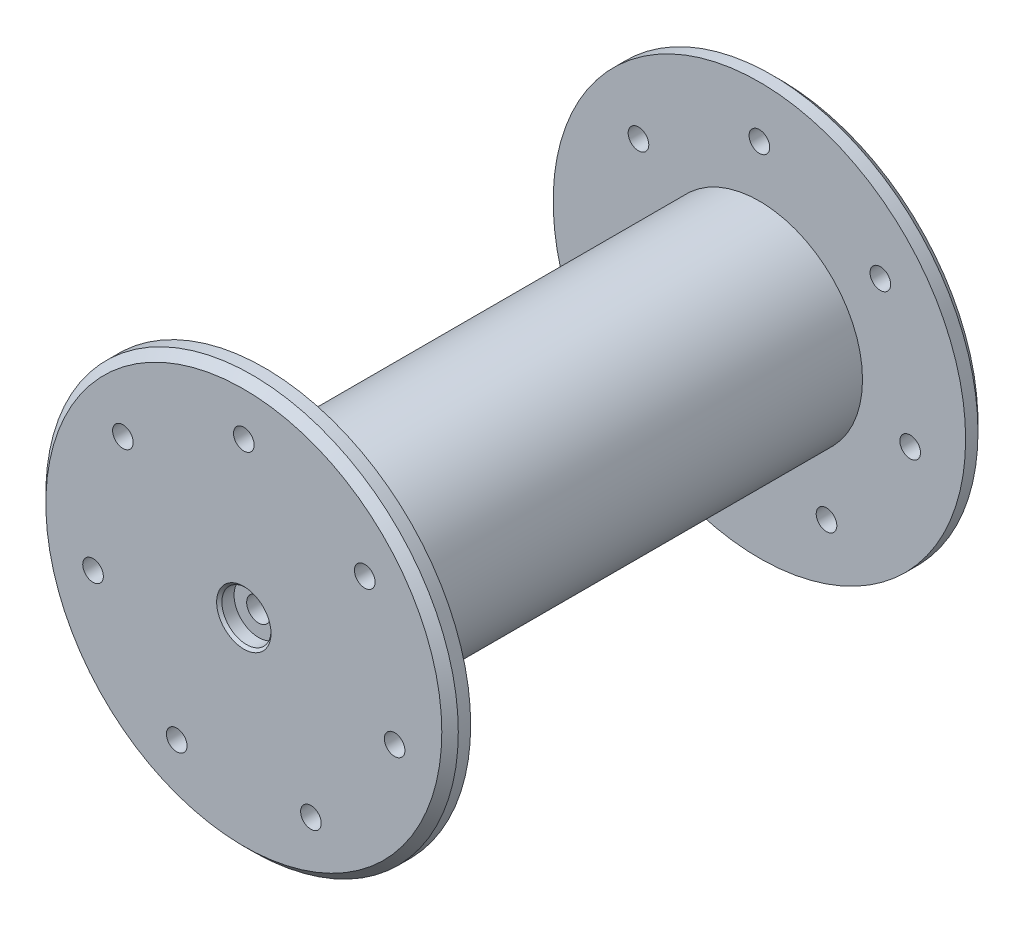
ISO-10303-21;
HEADER;
FILE_DESCRIPTION(('STEP AP214'),'2;1');
FILE_NAME('part.step','',(''),(''),'','','');
FILE_SCHEMA(('AUTOMOTIVE_DESIGN { 1 0 10303 214 1 1 1 1 }'));
ENDSEC;
DATA;
#1=APPLICATION_CONTEXT('core data for automotive mechanical design processes');
#2=APPLICATION_PROTOCOL_DEFINITION('international standard','automotive_design',2000,#1);
#3=PRODUCT_CONTEXT('',#1,'mechanical');
#4=PRODUCT('Part','Part','',(#3));
#5=PRODUCT_RELATED_PRODUCT_CATEGORY('part','',(#4));
#6=PRODUCT_DEFINITION_FORMATION('','',#4);
#7=PRODUCT_DEFINITION_CONTEXT('part definition',#1,'design');
#8=PRODUCT_DEFINITION('design','',#6,#7);
#9=PRODUCT_DEFINITION_SHAPE('','',#8);
#10=(LENGTH_UNIT() NAMED_UNIT(*) SI_UNIT(.MILLI.,.METRE.));
#11=(NAMED_UNIT(*) PLANE_ANGLE_UNIT() SI_UNIT($,.RADIAN.));
#12=(NAMED_UNIT(*) SI_UNIT($,.STERADIAN.) SOLID_ANGLE_UNIT());
#13=UNCERTAINTY_MEASURE_WITH_UNIT(LENGTH_MEASURE(1.E-05),#10,'distance_accuracy_value','');
#14=(GEOMETRIC_REPRESENTATION_CONTEXT(3) GLOBAL_UNCERTAINTY_ASSIGNED_CONTEXT((#13)) GLOBAL_UNIT_ASSIGNED_CONTEXT((#10,
#11,#12)) REPRESENTATION_CONTEXT('',''));
#15=CARTESIAN_POINT('',(0.,0.,0.));
#16=DIRECTION('',(0.,0.,1.));
#17=DIRECTION('',(1.,0.,0.));
#18=AXIS2_PLACEMENT_3D('',#15,#16,#17);
#19=CARTESIAN_POINT('',(0.,0.,60.));
#20=DIRECTION('',(0.,0.,-1.));
#21=DIRECTION('',(-1.,0.,0.));
#22=AXIS2_PLACEMENT_3D('',#19,#20,#21);
#23=CYLINDRICAL_SURFACE('',#22,25.);
#24=CARTESIAN_POINT('',(0.,0.,60.));
#25=DIRECTION('',(0.,0.,1.));
#26=DIRECTION('',(1.,0.,0.));
#27=AXIS2_PLACEMENT_3D('',#24,#25,#26);
#28=CIRCLE('',#27,25.);
#29=CARTESIAN_POINT('',(25.,0.,60.));
#30=VERTEX_POINT('',#29);
#31=EDGE_CURVE('E92',#30,#30,#28,.T.);
#32=ORIENTED_EDGE('',*,*,#31,.F.);
#33=EDGE_LOOP('',(#32));
#34=FACE_BOUND('',#33,.T.);
#35=CARTESIAN_POINT('',(0.,0.,-60.));
#36=DIRECTION('',(0.,0.,1.));
#37=DIRECTION('',(1.,0.,0.));
#38=AXIS2_PLACEMENT_3D('',#35,#36,#37);
#39=CIRCLE('',#38,25.);
#40=CARTESIAN_POINT('',(25.,0.,-60.));
#41=VERTEX_POINT('',#40);
#42=EDGE_CURVE('E93',#41,#41,#39,.T.);
#43=ORIENTED_EDGE('',*,*,#42,.T.);
#44=EDGE_LOOP('',(#43));
#45=FACE_BOUND('',#44,.T.);
#46=ADVANCED_FACE('F37',(#34,#45),#23,.T.);
#47=CARTESIAN_POINT('',(0.,0.,65.));
#48=DIRECTION('',(0.,0.,-1.));
#49=DIRECTION('',(-1.,0.,0.));
#50=AXIS2_PLACEMENT_3D('',#47,#48,#49);
#51=CYLINDRICAL_SURFACE('',#50,50.);
#52=CARTESIAN_POINT('',(0.,0.,63.));
#53=DIRECTION('',(0.,0.,1.));
#54=DIRECTION('',(1.,0.,0.));
#55=AXIS2_PLACEMENT_3D('',#52,#53,#54);
#56=CIRCLE('',#55,50.);
#57=CARTESIAN_POINT('',(50.,0.,63.));
#58=VERTEX_POINT('',#57);
#59=EDGE_CURVE('E50',#58,#58,#56,.F.);
#60=ORIENTED_EDGE('',*,*,#59,.T.);
#61=EDGE_LOOP('',(#60));
#62=FACE_BOUND('',#61,.T.);
#63=CARTESIAN_POINT('',(0.,0.,60.));
#64=DIRECTION('',(0.,0.,1.));
#65=DIRECTION('',(1.,0.,0.));
#66=AXIS2_PLACEMENT_3D('',#63,#64,#65);
#67=CIRCLE('',#66,50.);
#68=CARTESIAN_POINT('',(50.,0.,60.));
#69=VERTEX_POINT('',#68);
#70=EDGE_CURVE('E87',#69,#69,#67,.T.);
#71=ORIENTED_EDGE('',*,*,#70,.T.);
#72=EDGE_LOOP('',(#71));
#73=FACE_BOUND('',#72,.T.);
#74=ADVANCED_FACE('F268',(#62,#73),#51,.T.);
#75=CARTESIAN_POINT('',(0.,0.,65.));
#76=DIRECTION('',(0.,0.,1.));
#77=DIRECTION('',(1.,0.,0.));
#78=AXIS2_PLACEMENT_3D('',#75,#76,#77);
#79=PLANE('',#78);
#80=CARTESIAN_POINT('',(0.,0.,65.));
#81=DIRECTION('',(0.,0.,1.));
#82=DIRECTION('',(1.,0.,0.));
#83=AXIS2_PLACEMENT_3D('',#80,#81,#82);
#84=CIRCLE('',#83,6.58876);
#85=CARTESIAN_POINT('',(6.58876,0.,65.));
#86=VERTEX_POINT('',#85);
#87=EDGE_CURVE('E97',#86,#86,#84,.T.);
#88=ORIENTED_EDGE('',*,*,#87,.F.);
#89=EDGE_LOOP('',(#88));
#90=FACE_BOUND('',#89,.T.);
#91=CARTESIAN_POINT('',(-29.3186805925508,23.3808675697029,65.));
#92=DIRECTION('',(0.,0.,1.));
#93=DIRECTION('',(0.623489801858743,0.781831482468022,0.));
#94=AXIS2_PLACEMENT_3D('',#91,#92,#93);
#95=CIRCLE('',#94,2.5);
#96=CARTESIAN_POINT('',(-27.759956087904,25.3354462758729,65.));
#97=VERTEX_POINT('',#96);
#98=EDGE_CURVE('E112',#97,#97,#95,.T.);
#99=ORIENTED_EDGE('',*,*,#98,.F.);
#100=EDGE_LOOP('',(#99));
#101=FACE_BOUND('',#100,.T.);
#102=CARTESIAN_POINT('',(-36.5597967068185,-8.34453502336144,65.));
#103=DIRECTION('',(0.,0.,1.));
#104=DIRECTION('',(-0.222520933956305,0.974927912181826,0.));
#105=AXIS2_PLACEMENT_3D('',#102,#103,#104);
#106=CIRCLE('',#105,2.5);
#107=CARTESIAN_POINT('',(-37.1160990417092,-5.90721524290687,65.));
#108=VERTEX_POINT('',#107);
#109=EDGE_CURVE('E116',#108,#108,#106,.T.);
#110=ORIENTED_EDGE('',*,*,#109,.F.);
#111=EDGE_LOOP('',(#110));
#112=FACE_BOUND('',#111,.T.);
#113=CARTESIAN_POINT('',(-16.2706402169087,-33.7863325463406,65.));
#114=DIRECTION('',(0.,0.,1.));
#115=DIRECTION('',(-0.900968867902416,0.433883739117565,0.));
#116=AXIS2_PLACEMENT_3D('',#113,#114,#115);
#117=CIRCLE('',#116,2.5);
#118=CARTESIAN_POINT('',(-18.5230623866647,-32.7016231985467,65.));
#119=VERTEX_POINT('',#118);
#120=EDGE_CURVE('E121',#119,#119,#117,.T.);
#121=ORIENTED_EDGE('',*,*,#120,.F.);
#122=EDGE_LOOP('',(#121));
#123=FACE_BOUND('',#122,.T.);
#124=CARTESIAN_POINT('',(16.2706402169082,-33.7863325463408,65.));
#125=DIRECTION('',(0.,0.,1.));
#126=DIRECTION('',(-0.900968867902422,-0.433883739117553,0.));
#127=AXIS2_PLACEMENT_3D('',#124,#125,#126);
#128=CIRCLE('',#127,2.5);
#129=CARTESIAN_POINT('',(14.0182180471522,-34.8710418941347,65.));
#130=VERTEX_POINT('',#129);
#131=EDGE_CURVE('E125',#130,#130,#128,.T.);
#132=ORIENTED_EDGE('',*,*,#131,.F.);
#133=EDGE_LOOP('',(#132));
#134=FACE_BOUND('',#133,.T.);
#135=CARTESIAN_POINT('',(36.5597967068184,-8.34453502336193,65.));
#136=DIRECTION('',(0.,0.,1.));
#137=DIRECTION('',(-0.222520933956318,-0.974927912181823,0.));
#138=AXIS2_PLACEMENT_3D('',#135,#136,#137);
#139=CIRCLE('',#138,2.5);
#140=CARTESIAN_POINT('',(36.0034943719276,-10.7818548038165,65.));
#141=VERTEX_POINT('',#140);
#142=EDGE_CURVE('E111',#141,#141,#139,.T.);
#143=ORIENTED_EDGE('',*,*,#142,.F.);
#144=EDGE_LOOP('',(#143));
#145=FACE_BOUND('',#144,.T.);
#146=CARTESIAN_POINT('',(29.3186805925512,23.3808675697025,65.));
#147=DIRECTION('',(0.,0.,1.));
#148=DIRECTION('',(0.623489801858732,-0.781831482468031,0.));
#149=AXIS2_PLACEMENT_3D('',#146,#147,#148);
#150=CIRCLE('',#149,2.5);
#151=CARTESIAN_POINT('',(30.877405097198,21.4262888635324,65.));
#152=VERTEX_POINT('',#151);
#153=EDGE_CURVE('E83',#152,#152,#150,.T.);
#154=ORIENTED_EDGE('',*,*,#153,.F.);
#155=EDGE_LOOP('',(#154));
#156=FACE_BOUND('',#155,.T.);
#157=CARTESIAN_POINT('',(0.,37.5,65.));
#158=DIRECTION('',(0.,0.,1.));
#159=DIRECTION('',(1.,0.,0.));
#160=AXIS2_PLACEMENT_3D('',#157,#158,#159);
#161=CIRCLE('',#160,2.5);
#162=CARTESIAN_POINT('',(2.5,37.5,65.));
#163=VERTEX_POINT('',#162);
#164=EDGE_CURVE('E62',#163,#163,#161,.T.);
#165=ORIENTED_EDGE('',*,*,#164,.F.);
#166=EDGE_LOOP('',(#165));
#167=FACE_BOUND('',#166,.T.);
#168=CARTESIAN_POINT('',(0.,0.,65.));
#169=DIRECTION('',(0.,0.,1.));
#170=DIRECTION('',(1.,0.,0.));
#171=AXIS2_PLACEMENT_3D('',#168,#169,#170);
#172=CIRCLE('',#171,48.);
#173=CARTESIAN_POINT('',(48.,0.,65.));
#174=VERTEX_POINT('',#173);
#175=EDGE_CURVE('E55',#174,#174,#172,.T.);
#176=ORIENTED_EDGE('',*,*,#175,.T.);
#177=EDGE_LOOP('',(#176));
#178=FACE_BOUND('',#177,.T.);
#179=ADVANCED_FACE('F274',(#90,#101,#112,#123,#134,#145,#156,#167,#178),#79,.T.);
#180=CARTESIAN_POINT('',(0.,0.,60.));
#181=DIRECTION('',(0.,0.,1.));
#182=DIRECTION('',(1.,0.,0.));
#183=AXIS2_PLACEMENT_3D('',#180,#181,#182);
#184=PLANE('',#183);
#185=CARTESIAN_POINT('',(-29.3186805925508,23.3808675697029,60.));
#186=DIRECTION('',(0.,0.,1.));
#187=DIRECTION('',(1.,0.,0.));
#188=AXIS2_PLACEMENT_3D('',#185,#186,#187);
#189=CIRCLE('',#188,2.5);
#190=CARTESIAN_POINT('',(-26.8186805925508,23.3808675697029,60.));
#191=VERTEX_POINT('',#190);
#192=EDGE_CURVE('E58',#191,#191,#189,.T.);
#193=ORIENTED_EDGE('',*,*,#192,.T.);
#194=EDGE_LOOP('',(#193));
#195=FACE_BOUND('',#194,.T.);
#196=CARTESIAN_POINT('',(-36.5597967068185,-8.34453502336144,60.));
#197=DIRECTION('',(0.,0.,1.));
#198=DIRECTION('',(1.,0.,0.));
#199=AXIS2_PLACEMENT_3D('',#196,#197,#198);
#200=CIRCLE('',#199,2.5);
#201=CARTESIAN_POINT('',(-34.0597967068185,-8.34453502336144,60.));
#202=VERTEX_POINT('',#201);
#203=EDGE_CURVE('E63',#202,#202,#200,.T.);
#204=ORIENTED_EDGE('',*,*,#203,.T.);
#205=EDGE_LOOP('',(#204));
#206=FACE_BOUND('',#205,.T.);
#207=CARTESIAN_POINT('',(-16.2706402169087,-33.7863325463406,60.));
#208=DIRECTION('',(0.,0.,1.));
#209=DIRECTION('',(1.,0.,0.));
#210=AXIS2_PLACEMENT_3D('',#207,#208,#209);
#211=CIRCLE('',#210,2.5);
#212=CARTESIAN_POINT('',(-13.7706402169087,-33.7863325463406,60.));
#213=VERTEX_POINT('',#212);
#214=EDGE_CURVE('E67',#213,#213,#211,.T.);
#215=ORIENTED_EDGE('',*,*,#214,.T.);
#216=EDGE_LOOP('',(#215));
#217=FACE_BOUND('',#216,.T.);
#218=CARTESIAN_POINT('',(16.2706402169082,-33.7863325463408,60.));
#219=DIRECTION('',(0.,0.,1.));
#220=DIRECTION('',(1.,0.,0.));
#221=AXIS2_PLACEMENT_3D('',#218,#219,#220);
#222=CIRCLE('',#221,2.5);
#223=CARTESIAN_POINT('',(18.7706402169082,-33.7863325463408,60.));
#224=VERTEX_POINT('',#223);
#225=EDGE_CURVE('E71',#224,#224,#222,.T.);
#226=ORIENTED_EDGE('',*,*,#225,.T.);
#227=EDGE_LOOP('',(#226));
#228=FACE_BOUND('',#227,.T.);
#229=CARTESIAN_POINT('',(36.5597967068184,-8.34453502336193,60.));
#230=DIRECTION('',(0.,0.,1.));
#231=DIRECTION('',(1.,0.,0.));
#232=AXIS2_PLACEMENT_3D('',#229,#230,#231);
#233=CIRCLE('',#232,2.5);
#234=CARTESIAN_POINT('',(39.0597967068184,-8.34453502336193,60.));
#235=VERTEX_POINT('',#234);
#236=EDGE_CURVE('E75',#235,#235,#233,.T.);
#237=ORIENTED_EDGE('',*,*,#236,.T.);
#238=EDGE_LOOP('',(#237));
#239=FACE_BOUND('',#238,.T.);
#240=CARTESIAN_POINT('',(29.3186805925512,23.3808675697025,60.));
#241=DIRECTION('',(0.,0.,1.));
#242=DIRECTION('',(1.,0.,0.));
#243=AXIS2_PLACEMENT_3D('',#240,#241,#242);
#244=CIRCLE('',#243,2.5);
#245=CARTESIAN_POINT('',(31.8186805925512,23.3808675697025,60.));
#246=VERTEX_POINT('',#245);
#247=EDGE_CURVE('E79',#246,#246,#244,.T.);
#248=ORIENTED_EDGE('',*,*,#247,.T.);
#249=EDGE_LOOP('',(#248));
#250=FACE_BOUND('',#249,.T.);
#251=CARTESIAN_POINT('',(0.,37.5,60.));
#252=DIRECTION('',(0.,0.,1.));
#253=DIRECTION('',(1.,0.,0.));
#254=AXIS2_PLACEMENT_3D('',#251,#252,#253);
#255=CIRCLE('',#254,2.5);
#256=CARTESIAN_POINT('',(2.5,37.5,60.));
#257=VERTEX_POINT('',#256);
#258=EDGE_CURVE('E84',#257,#257,#255,.T.);
#259=ORIENTED_EDGE('',*,*,#258,.T.);
#260=EDGE_LOOP('',(#259));
#261=FACE_BOUND('',#260,.T.);
#262=ORIENTED_EDGE('',*,*,#31,.T.);
#263=EDGE_LOOP('',(#262));
#264=FACE_BOUND('',#263,.T.);
#265=ORIENTED_EDGE('',*,*,#70,.F.);
#266=EDGE_LOOP('',(#265));
#267=FACE_BOUND('',#266,.T.);
#268=ADVANCED_FACE('F283',(#195,#206,#217,#228,#239,#250,#261,#264,#267),#184,.F.);
#269=CARTESIAN_POINT('',(0.,0.,65.));
#270=DIRECTION('',(0.,0.,-1.));
#271=DIRECTION('',(-1.,0.,0.));
#272=AXIS2_PLACEMENT_3D('',#269,#270,#271);
#273=CONICAL_SURFACE('',#272,48.,0.785398163397445);
#274=ORIENTED_EDGE('',*,*,#59,.F.);
#275=EDGE_LOOP('',(#274));
#276=FACE_BOUND('',#275,.T.);
#277=ORIENTED_EDGE('',*,*,#175,.F.);
#278=EDGE_LOOP('',(#277));
#279=FACE_BOUND('',#278,.T.);
#280=ADVANCED_FACE('F280',(#276,#279),#273,.T.);
#281=CARTESIAN_POINT('',(0.,37.5,-60.));
#282=DIRECTION('',(0.,0.,1.));
#283=DIRECTION('',(1.,0.,0.));
#284=AXIS2_PLACEMENT_3D('',#281,#282,#283);
#285=CYLINDRICAL_SURFACE('',#284,2.5);
#286=ORIENTED_EDGE('',*,*,#164,.T.);
#287=EDGE_LOOP('',(#286));
#288=FACE_BOUND('',#287,.T.);
#289=ORIENTED_EDGE('',*,*,#258,.F.);
#290=EDGE_LOOP('',(#289));
#291=FACE_BOUND('',#290,.T.);
#292=ADVANCED_FACE('F282',(#288,#291),#285,.F.);
#293=CARTESIAN_POINT('',(29.3186805925512,23.3808675697025,-60.));
#294=DIRECTION('',(0.,0.,1.));
#295=DIRECTION('',(1.,0.,0.));
#296=AXIS2_PLACEMENT_3D('',#293,#294,#295);
#297=CYLINDRICAL_SURFACE('',#296,2.5);
#298=ORIENTED_EDGE('',*,*,#153,.T.);
#299=EDGE_LOOP('',(#298));
#300=FACE_BOUND('',#299,.T.);
#301=ORIENTED_EDGE('',*,*,#247,.F.);
#302=EDGE_LOOP('',(#301));
#303=FACE_BOUND('',#302,.T.);
#304=ADVANCED_FACE('F289',(#300,#303),#297,.F.);
#305=CARTESIAN_POINT('',(36.5597967068184,-8.34453502336193,-60.));
#306=DIRECTION('',(0.,0.,1.));
#307=DIRECTION('',(1.,0.,0.));
#308=AXIS2_PLACEMENT_3D('',#305,#306,#307);
#309=CYLINDRICAL_SURFACE('',#308,2.5);
#310=ORIENTED_EDGE('',*,*,#142,.T.);
#311=EDGE_LOOP('',(#310));
#312=FACE_BOUND('',#311,.T.);
#313=ORIENTED_EDGE('',*,*,#236,.F.);
#314=EDGE_LOOP('',(#313));
#315=FACE_BOUND('',#314,.T.);
#316=ADVANCED_FACE('F307',(#312,#315),#309,.F.);
#317=CARTESIAN_POINT('',(16.2706402169082,-33.7863325463408,-60.));
#318=DIRECTION('',(0.,0.,1.));
#319=DIRECTION('',(1.,0.,0.));
#320=AXIS2_PLACEMENT_3D('',#317,#318,#319);
#321=CYLINDRICAL_SURFACE('',#320,2.5);
#322=ORIENTED_EDGE('',*,*,#131,.T.);
#323=EDGE_LOOP('',(#322));
#324=FACE_BOUND('',#323,.T.);
#325=ORIENTED_EDGE('',*,*,#225,.F.);
#326=EDGE_LOOP('',(#325));
#327=FACE_BOUND('',#326,.T.);
#328=ADVANCED_FACE('F321',(#324,#327),#321,.F.);
#329=CARTESIAN_POINT('',(-16.2706402169087,-33.7863325463406,-60.));
#330=DIRECTION('',(0.,0.,1.));
#331=DIRECTION('',(1.,0.,0.));
#332=AXIS2_PLACEMENT_3D('',#329,#330,#331);
#333=CYLINDRICAL_SURFACE('',#332,2.5);
#334=ORIENTED_EDGE('',*,*,#120,.T.);
#335=EDGE_LOOP('',(#334));
#336=FACE_BOUND('',#335,.T.);
#337=ORIENTED_EDGE('',*,*,#214,.F.);
#338=EDGE_LOOP('',(#337));
#339=FACE_BOUND('',#338,.T.);
#340=ADVANCED_FACE('F317',(#336,#339),#333,.F.);
#341=CARTESIAN_POINT('',(-36.5597967068185,-8.34453502336144,-60.));
#342=DIRECTION('',(0.,0.,1.));
#343=DIRECTION('',(1.,0.,0.));
#344=AXIS2_PLACEMENT_3D('',#341,#342,#343);
#345=CYLINDRICAL_SURFACE('',#344,2.5);
#346=ORIENTED_EDGE('',*,*,#109,.T.);
#347=EDGE_LOOP('',(#346));
#348=FACE_BOUND('',#347,.T.);
#349=ORIENTED_EDGE('',*,*,#203,.F.);
#350=EDGE_LOOP('',(#349));
#351=FACE_BOUND('',#350,.T.);
#352=ADVANCED_FACE('F313',(#348,#351),#345,.F.);
#353=CARTESIAN_POINT('',(-29.3186805925508,23.3808675697029,-60.));
#354=DIRECTION('',(0.,0.,1.));
#355=DIRECTION('',(1.,0.,0.));
#356=AXIS2_PLACEMENT_3D('',#353,#354,#355);
#357=CYLINDRICAL_SURFACE('',#356,2.5);
#358=ORIENTED_EDGE('',*,*,#98,.T.);
#359=EDGE_LOOP('',(#358));
#360=FACE_BOUND('',#359,.T.);
#361=ORIENTED_EDGE('',*,*,#192,.F.);
#362=EDGE_LOOP('',(#361));
#363=FACE_BOUND('',#362,.T.);
#364=ADVANCED_FACE('F309',(#360,#363),#357,.F.);
#365=CARTESIAN_POINT('',(0.,0.,65.));
#366=DIRECTION('',(0.,0.,1.));
#367=DIRECTION('',(1.,0.,0.));
#368=AXIS2_PLACEMENT_3D('',#365,#366,#367);
#369=CYLINDRICAL_SURFACE('',#368,2.89559999999999);
#370=CARTESIAN_POINT('',(0.,0.,61.4186));
#371=DIRECTION('',(0.,0.,1.));
#372=DIRECTION('',(1.,0.,0.));
#373=AXIS2_PLACEMENT_3D('',#370,#371,#372);
#374=CIRCLE('',#373,2.8956);
#375=CARTESIAN_POINT('',(2.8956,0.,61.4186));
#376=VERTEX_POINT('',#375);
#377=EDGE_CURVE('E117',#376,#376,#374,.T.);
#378=ORIENTED_EDGE('',*,*,#377,.T.);
#379=EDGE_LOOP('',(#378));
#380=FACE_BOUND('',#379,.T.);
#381=CARTESIAN_POINT('',(0.,0.,-61.4186));
#382=DIRECTION('',(0.,0.,-1.));
#383=DIRECTION('',(-1.,0.,0.));
#384=AXIS2_PLACEMENT_3D('',#381,#382,#383);
#385=CIRCLE('',#384,2.8956);
#386=CARTESIAN_POINT('',(-2.8956,0.,-61.4186));
#387=VERTEX_POINT('',#386);
#388=EDGE_CURVE('E187',#387,#387,#385,.T.);
#389=ORIENTED_EDGE('',*,*,#388,.T.);
#390=EDGE_LOOP('',(#389));
#391=FACE_BOUND('',#390,.T.);
#392=ADVANCED_FACE('F312',(#380,#391),#369,.F.);
#393=CARTESIAN_POINT('',(5.95376,0.,61.4186));
#394=DIRECTION('',(0.,0.,-1.));
#395=DIRECTION('',(-1.,0.,0.));
#396=AXIS2_PLACEMENT_3D('',#393,#394,#395);
#397=PLANE('',#396);
#398=ORIENTED_EDGE('',*,*,#377,.F.);
#399=EDGE_LOOP('',(#398));
#400=FACE_BOUND('',#399,.T.);
#401=CARTESIAN_POINT('',(0.,0.,61.4186));
#402=DIRECTION('',(0.,0.,1.));
#403=DIRECTION('',(1.,0.,0.));
#404=AXIS2_PLACEMENT_3D('',#401,#402,#403);
#405=CIRCLE('',#404,5.95376);
#406=CARTESIAN_POINT('',(5.95376,0.,61.4186));
#407=VERTEX_POINT('',#406);
#408=EDGE_CURVE('E135',#407,#407,#405,.T.);
#409=ORIENTED_EDGE('',*,*,#408,.T.);
#410=EDGE_LOOP('',(#409));
#411=FACE_BOUND('',#410,.T.);
#412=ADVANCED_FACE('F331',(#400,#411),#397,.F.);
#413=CARTESIAN_POINT('',(0.,0.,65.));
#414=DIRECTION('',(0.,0.,1.));
#415=DIRECTION('',(1.,0.,0.));
#416=AXIS2_PLACEMENT_3D('',#413,#414,#415);
#417=CYLINDRICAL_SURFACE('',#416,5.95376);
#418=ORIENTED_EDGE('',*,*,#408,.F.);
#419=EDGE_LOOP('',(#418));
#420=FACE_BOUND('',#419,.T.);
#421=CARTESIAN_POINT('',(0.,0.,64.365));
#422=DIRECTION('',(0.,0.,1.));
#423=DIRECTION('',(1.,0.,0.));
#424=AXIS2_PLACEMENT_3D('',#421,#422,#423);
#425=CIRCLE('',#424,5.95376);
#426=CARTESIAN_POINT('',(5.95376,0.,64.365));
#427=VERTEX_POINT('',#426);
#428=EDGE_CURVE('E139',#427,#427,#425,.T.);
#429=ORIENTED_EDGE('',*,*,#428,.T.);
#430=EDGE_LOOP('',(#429));
#431=FACE_BOUND('',#430,.T.);
#432=ADVANCED_FACE('F335',(#420,#431),#417,.F.);
#433=CARTESIAN_POINT('',(0.,0.,65.));
#434=DIRECTION('',(0.,0.,1.));
#435=DIRECTION('',(1.,0.,0.));
#436=AXIS2_PLACEMENT_3D('',#433,#434,#435);
#437=CONICAL_SURFACE('',#436,6.58876,0.785398163397451);
#438=ORIENTED_EDGE('',*,*,#428,.F.);
#439=EDGE_LOOP('',(#438));
#440=FACE_BOUND('',#439,.T.);
#441=ORIENTED_EDGE('',*,*,#87,.T.);
#442=EDGE_LOOP('',(#441));
#443=FACE_BOUND('',#442,.T.);
#444=ADVANCED_FACE('F253',(#440,#443),#437,.F.);
#445=CARTESIAN_POINT('',(0.,0.,-60.));
#446=DIRECTION('',(0.,0.,-1.));
#447=DIRECTION('',(1.,0.,0.));
#448=AXIS2_PLACEMENT_3D('',#445,#446,#447);
#449=PLANE('',#448);
#450=CARTESIAN_POINT('',(29.3186805925512,23.3808675697025,-60.));
#451=DIRECTION('',(0.,0.,-1.));
#452=DIRECTION('',(-1.,0.,0.));
#453=AXIS2_PLACEMENT_3D('',#450,#451,#452);
#454=CIRCLE('',#453,2.5);
#455=CARTESIAN_POINT('',(26.8186805925512,23.3808675697025,-60.));
#456=VERTEX_POINT('',#455);
#457=EDGE_CURVE('E157',#456,#456,#454,.F.);
#458=ORIENTED_EDGE('',*,*,#457,.F.);
#459=EDGE_LOOP('',(#458));
#460=FACE_BOUND('',#459,.T.);
#461=CARTESIAN_POINT('',(36.5597967068184,-8.34453502336193,-60.));
#462=DIRECTION('',(0.,0.,-1.));
#463=DIRECTION('',(-1.,0.,0.));
#464=AXIS2_PLACEMENT_3D('',#461,#462,#463);
#465=CIRCLE('',#464,2.5);
#466=CARTESIAN_POINT('',(34.0597967068184,-8.34453502336193,-60.));
#467=VERTEX_POINT('',#466);
#468=EDGE_CURVE('E161',#467,#467,#465,.F.);
#469=ORIENTED_EDGE('',*,*,#468,.F.);
#470=EDGE_LOOP('',(#469));
#471=FACE_BOUND('',#470,.T.);
#472=CARTESIAN_POINT('',(16.2706402169082,-33.7863325463408,-60.));
#473=DIRECTION('',(0.,0.,-1.));
#474=DIRECTION('',(-1.,0.,0.));
#475=AXIS2_PLACEMENT_3D('',#472,#473,#474);
#476=CIRCLE('',#475,2.5);
#477=CARTESIAN_POINT('',(13.7706402169082,-33.7863325463408,-60.));
#478=VERTEX_POINT('',#477);
#479=EDGE_CURVE('E165',#478,#478,#476,.F.);
#480=ORIENTED_EDGE('',*,*,#479,.F.);
#481=EDGE_LOOP('',(#480));
#482=FACE_BOUND('',#481,.T.);
#483=CARTESIAN_POINT('',(-16.2706402169087,-33.7863325463406,-60.));
#484=DIRECTION('',(0.,0.,-1.));
#485=DIRECTION('',(-1.,0.,0.));
#486=AXIS2_PLACEMENT_3D('',#483,#484,#485);
#487=CIRCLE('',#486,2.5);
#488=CARTESIAN_POINT('',(-18.7706402169087,-33.7863325463406,-60.));
#489=VERTEX_POINT('',#488);
#490=EDGE_CURVE('E169',#489,#489,#487,.F.);
#491=ORIENTED_EDGE('',*,*,#490,.F.);
#492=EDGE_LOOP('',(#491));
#493=FACE_BOUND('',#492,.T.);
#494=CARTESIAN_POINT('',(-36.5597967068185,-8.34453502336144,-60.));
#495=DIRECTION('',(0.,0.,-1.));
#496=DIRECTION('',(-1.,0.,0.));
#497=AXIS2_PLACEMENT_3D('',#494,#495,#496);
#498=CIRCLE('',#497,2.5);
#499=CARTESIAN_POINT('',(-39.0597967068185,-8.34453502336144,-60.));
#500=VERTEX_POINT('',#499);
#501=EDGE_CURVE('E173',#500,#500,#498,.F.);
#502=ORIENTED_EDGE('',*,*,#501,.F.);
#503=EDGE_LOOP('',(#502));
#504=FACE_BOUND('',#503,.T.);
#505=CARTESIAN_POINT('',(-29.3186805925508,23.3808675697029,-60.));
#506=DIRECTION('',(0.,0.,-1.));
#507=DIRECTION('',(-1.,0.,0.));
#508=AXIS2_PLACEMENT_3D('',#505,#506,#507);
#509=CIRCLE('',#508,2.5);
#510=CARTESIAN_POINT('',(-31.8186805925508,23.3808675697029,-60.));
#511=VERTEX_POINT('',#510);
#512=EDGE_CURVE('E177',#511,#511,#509,.F.);
#513=ORIENTED_EDGE('',*,*,#512,.F.);
#514=EDGE_LOOP('',(#513));
#515=FACE_BOUND('',#514,.T.);
#516=CARTESIAN_POINT('',(0.,37.5,-60.));
#517=DIRECTION('',(0.,0.,-1.));
#518=DIRECTION('',(-1.,0.,0.));
#519=AXIS2_PLACEMENT_3D('',#516,#517,#518);
#520=CIRCLE('',#519,2.5);
#521=CARTESIAN_POINT('',(-2.5,37.5,-60.));
#522=VERTEX_POINT('',#521);
#523=EDGE_CURVE('E149',#522,#522,#520,.F.);
#524=ORIENTED_EDGE('',*,*,#523,.F.);
#525=EDGE_LOOP('',(#524));
#526=FACE_BOUND('',#525,.T.);
#527=ORIENTED_EDGE('',*,*,#42,.F.);
#528=EDGE_LOOP('',(#527));
#529=FACE_BOUND('',#528,.T.);
#530=CARTESIAN_POINT('',(0.,0.,-60.));
#531=DIRECTION('',(0.,0.,1.));
#532=DIRECTION('',(1.,0.,0.));
#533=AXIS2_PLACEMENT_3D('',#530,#531,#532);
#534=CIRCLE('',#533,50.);
#535=CARTESIAN_POINT('',(50.,0.,-60.));
#536=VERTEX_POINT('',#535);
#537=EDGE_CURVE('E98',#536,#536,#534,.T.);
#538=ORIENTED_EDGE('',*,*,#537,.T.);
#539=EDGE_LOOP('',(#538));
#540=FACE_BOUND('',#539,.T.);
#541=ADVANCED_FACE('F228',(#460,#471,#482,#493,#504,#515,#526,#529,#540),#449,.F.);
#542=CARTESIAN_POINT('',(0.,0.,-65.));
#543=DIRECTION('',(0.,0.,-1.));
#544=DIRECTION('',(1.,0.,0.));
#545=AXIS2_PLACEMENT_3D('',#542,#543,#544);
#546=PLANE('',#545);
#547=CARTESIAN_POINT('',(0.,0.,-65.));
#548=DIRECTION('',(0.,0.,-1.));
#549=DIRECTION('',(-1.,0.,0.));
#550=AXIS2_PLACEMENT_3D('',#547,#548,#549);
#551=CIRCLE('',#550,6.58876);
#552=CARTESIAN_POINT('',(-6.58876,0.,-65.));
#553=VERTEX_POINT('',#552);
#554=EDGE_CURVE('E217',#553,#553,#551,.T.);
#555=ORIENTED_EDGE('',*,*,#554,.F.);
#556=EDGE_LOOP('',(#555));
#557=FACE_BOUND('',#556,.T.);
#558=CARTESIAN_POINT('',(29.3186805925512,23.3808675697025,-65.));
#559=DIRECTION('',(0.,0.,1.));
#560=DIRECTION('',(0.623489801858732,-0.781831482468031,0.));
#561=AXIS2_PLACEMENT_3D('',#558,#559,#560);
#562=CIRCLE('',#561,2.5);
#563=CARTESIAN_POINT('',(30.877405097198,21.4262888635324,-65.));
#564=VERTEX_POINT('',#563);
#565=EDGE_CURVE('E181',#564,#564,#562,.T.);
#566=ORIENTED_EDGE('',*,*,#565,.T.);
#567=EDGE_LOOP('',(#566));
#568=FACE_BOUND('',#567,.T.);
#569=CARTESIAN_POINT('',(36.5597967068184,-8.34453502336193,-65.));
#570=DIRECTION('',(0.,0.,1.));
#571=DIRECTION('',(-0.222520933956318,-0.974927912181823,0.));
#572=AXIS2_PLACEMENT_3D('',#569,#570,#571);
#573=CIRCLE('',#572,2.5);
#574=CARTESIAN_POINT('',(36.0034943719276,-10.7818548038165,-65.));
#575=VERTEX_POINT('',#574);
#576=EDGE_CURVE('E199',#575,#575,#573,.T.);
#577=ORIENTED_EDGE('',*,*,#576,.T.);
#578=EDGE_LOOP('',(#577));
#579=FACE_BOUND('',#578,.T.);
#580=CARTESIAN_POINT('',(16.2706402169082,-33.7863325463408,-65.));
#581=DIRECTION('',(0.,0.,1.));
#582=DIRECTION('',(-0.900968867902422,-0.433883739117553,0.));
#583=AXIS2_PLACEMENT_3D('',#580,#581,#582);
#584=CIRCLE('',#583,2.5);
#585=CARTESIAN_POINT('',(14.0182180471522,-34.8710418941347,-65.));
#586=VERTEX_POINT('',#585);
#587=EDGE_CURVE('E195',#586,#586,#584,.T.);
#588=ORIENTED_EDGE('',*,*,#587,.T.);
#589=EDGE_LOOP('',(#588));
#590=FACE_BOUND('',#589,.T.);
#591=CARTESIAN_POINT('',(-16.2706402169087,-33.7863325463406,-65.));
#592=DIRECTION('',(0.,0.,1.));
#593=DIRECTION('',(-0.900968867902416,0.433883739117565,0.));
#594=AXIS2_PLACEMENT_3D('',#591,#592,#593);
#595=CIRCLE('',#594,2.5);
#596=CARTESIAN_POINT('',(-18.5230623866647,-32.7016231985467,-65.));
#597=VERTEX_POINT('',#596);
#598=EDGE_CURVE('E191',#597,#597,#595,.T.);
#599=ORIENTED_EDGE('',*,*,#598,.T.);
#600=EDGE_LOOP('',(#599));
#601=FACE_BOUND('',#600,.T.);
#602=CARTESIAN_POINT('',(-36.5597967068185,-8.34453502336144,-65.));
#603=DIRECTION('',(0.,0.,1.));
#604=DIRECTION('',(-0.222520933956305,0.974927912181826,0.));
#605=AXIS2_PLACEMENT_3D('',#602,#603,#604);
#606=CIRCLE('',#605,2.5);
#607=CARTESIAN_POINT('',(-37.1160990417092,-5.90721524290687,-65.));
#608=VERTEX_POINT('',#607);
#609=EDGE_CURVE('E186',#608,#608,#606,.T.);
#610=ORIENTED_EDGE('',*,*,#609,.T.);
#611=EDGE_LOOP('',(#610));
#612=FACE_BOUND('',#611,.T.);
#613=CARTESIAN_POINT('',(-29.3186805925508,23.3808675697029,-65.));
#614=DIRECTION('',(0.,0.,1.));
#615=DIRECTION('',(0.623489801858743,0.781831482468022,0.));
#616=AXIS2_PLACEMENT_3D('',#613,#614,#615);
#617=CIRCLE('',#616,2.5);
#618=CARTESIAN_POINT('',(-27.759956087904,25.3354462758729,-65.));
#619=VERTEX_POINT('',#618);
#620=EDGE_CURVE('E182',#619,#619,#617,.T.);
#621=ORIENTED_EDGE('',*,*,#620,.T.);
#622=EDGE_LOOP('',(#621));
#623=FACE_BOUND('',#622,.T.);
#624=CARTESIAN_POINT('',(0.,37.5,-65.));
#625=DIRECTION('',(0.,0.,1.));
#626=DIRECTION('',(1.,0.,0.));
#627=AXIS2_PLACEMENT_3D('',#624,#625,#626);
#628=CIRCLE('',#627,2.5);
#629=CARTESIAN_POINT('',(2.5,37.5,-65.));
#630=VERTEX_POINT('',#629);
#631=EDGE_CURVE('E153',#630,#630,#628,.T.);
#632=ORIENTED_EDGE('',*,*,#631,.T.);
#633=EDGE_LOOP('',(#632));
#634=FACE_BOUND('',#633,.T.);
#635=CARTESIAN_POINT('',(0.,0.,-65.));
#636=DIRECTION('',(0.,0.,-1.));
#637=DIRECTION('',(-1.,0.,0.));
#638=AXIS2_PLACEMENT_3D('',#635,#636,#637);
#639=CIRCLE('',#638,48.);
#640=CARTESIAN_POINT('',(-48.,0.,-65.));
#641=VERTEX_POINT('',#640);
#642=EDGE_CURVE('E10',#641,#641,#639,.T.);
#643=ORIENTED_EDGE('',*,*,#642,.T.);
#644=EDGE_LOOP('',(#643));
#645=FACE_BOUND('',#644,.T.);
#646=ADVANCED_FACE('F224',(#557,#568,#579,#590,#601,#612,#623,#634,#645),#546,.T.);
#647=CARTESIAN_POINT('',(0.,0.,-65.));
#648=DIRECTION('',(0.,0.,1.));
#649=DIRECTION('',(1.,0.,0.));
#650=AXIS2_PLACEMENT_3D('',#647,#648,#649);
#651=CYLINDRICAL_SURFACE('',#650,50.);
#652=CARTESIAN_POINT('',(0.,0.,-63.));
#653=DIRECTION('',(0.,0.,-1.));
#654=DIRECTION('',(-1.,0.,0.));
#655=AXIS2_PLACEMENT_3D('',#652,#653,#654);
#656=CIRCLE('',#655,50.);
#657=CARTESIAN_POINT('',(-50.,0.,-63.));
#658=VERTEX_POINT('',#657);
#659=EDGE_CURVE('E45',#658,#658,#656,.F.);
#660=ORIENTED_EDGE('',*,*,#659,.T.);
#661=EDGE_LOOP('',(#660));
#662=FACE_BOUND('',#661,.T.);
#663=ORIENTED_EDGE('',*,*,#537,.F.);
#664=EDGE_LOOP('',(#663));
#665=FACE_BOUND('',#664,.T.);
#666=ADVANCED_FACE('F227',(#662,#665),#651,.T.);
#667=CARTESIAN_POINT('',(0.,0.,-63.));
#668=DIRECTION('',(0.,0.,1.));
#669=DIRECTION('',(1.,0.,0.));
#670=AXIS2_PLACEMENT_3D('',#667,#668,#669);
#671=CONICAL_SURFACE('',#670,50.,0.785398163397445);
#672=ORIENTED_EDGE('',*,*,#642,.F.);
#673=EDGE_LOOP('',(#672));
#674=FACE_BOUND('',#673,.T.);
#675=ORIENTED_EDGE('',*,*,#659,.F.);
#676=EDGE_LOOP('',(#675));
#677=FACE_BOUND('',#676,.T.);
#678=ADVANCED_FACE('F39',(#674,#677),#671,.T.);
#679=CARTESIAN_POINT('',(0.,37.5,65.));
#680=DIRECTION('',(0.,0.,-1.));
#681=DIRECTION('',(-1.,0.,0.));
#682=AXIS2_PLACEMENT_3D('',#679,#680,#681);
#683=CYLINDRICAL_SURFACE('',#682,2.5);
#684=ORIENTED_EDGE('',*,*,#631,.F.);
#685=EDGE_LOOP('',(#684));
#686=FACE_BOUND('',#685,.T.);
#687=ORIENTED_EDGE('',*,*,#523,.T.);
#688=EDGE_LOOP('',(#687));
#689=FACE_BOUND('',#688,.T.);
#690=ADVANCED_FACE('F244',(#686,#689),#683,.F.);
#691=CARTESIAN_POINT('',(-29.3186805925508,23.3808675697029,65.));
#692=DIRECTION('',(0.,0.,-1.));
#693=DIRECTION('',(-1.,0.,0.));
#694=AXIS2_PLACEMENT_3D('',#691,#692,#693);
#695=CYLINDRICAL_SURFACE('',#694,2.5);
#696=ORIENTED_EDGE('',*,*,#620,.F.);
#697=EDGE_LOOP('',(#696));
#698=FACE_BOUND('',#697,.T.);
#699=ORIENTED_EDGE('',*,*,#512,.T.);
#700=EDGE_LOOP('',(#699));
#701=FACE_BOUND('',#700,.T.);
#702=ADVANCED_FACE('F247',(#698,#701),#695,.F.);
#703=CARTESIAN_POINT('',(-36.5597967068185,-8.34453502336144,65.));
#704=DIRECTION('',(0.,0.,-1.));
#705=DIRECTION('',(-1.,0.,0.));
#706=AXIS2_PLACEMENT_3D('',#703,#704,#705);
#707=CYLINDRICAL_SURFACE('',#706,2.5);
#708=ORIENTED_EDGE('',*,*,#609,.F.);
#709=EDGE_LOOP('',(#708));
#710=FACE_BOUND('',#709,.T.);
#711=ORIENTED_EDGE('',*,*,#501,.T.);
#712=EDGE_LOOP('',(#711));
#713=FACE_BOUND('',#712,.T.);
#714=ADVANCED_FACE('F382',(#710,#713),#707,.F.);
#715=CARTESIAN_POINT('',(-16.2706402169087,-33.7863325463406,65.));
#716=DIRECTION('',(0.,0.,-1.));
#717=DIRECTION('',(-1.,0.,0.));
#718=AXIS2_PLACEMENT_3D('',#715,#716,#717);
#719=CYLINDRICAL_SURFACE('',#718,2.5);
#720=ORIENTED_EDGE('',*,*,#598,.F.);
#721=EDGE_LOOP('',(#720));
#722=FACE_BOUND('',#721,.T.);
#723=ORIENTED_EDGE('',*,*,#490,.T.);
#724=EDGE_LOOP('',(#723));
#725=FACE_BOUND('',#724,.T.);
#726=ADVANCED_FACE('F392',(#722,#725),#719,.F.);
#727=CARTESIAN_POINT('',(16.2706402169082,-33.7863325463408,65.));
#728=DIRECTION('',(0.,0.,-1.));
#729=DIRECTION('',(-1.,0.,0.));
#730=AXIS2_PLACEMENT_3D('',#727,#728,#729);
#731=CYLINDRICAL_SURFACE('',#730,2.5);
#732=ORIENTED_EDGE('',*,*,#587,.F.);
#733=EDGE_LOOP('',(#732));
#734=FACE_BOUND('',#733,.T.);
#735=ORIENTED_EDGE('',*,*,#479,.T.);
#736=EDGE_LOOP('',(#735));
#737=FACE_BOUND('',#736,.T.);
#738=ADVANCED_FACE('F402',(#734,#737),#731,.F.);
#739=CARTESIAN_POINT('',(36.5597967068184,-8.34453502336193,65.));
#740=DIRECTION('',(0.,0.,-1.));
#741=DIRECTION('',(-1.,0.,0.));
#742=AXIS2_PLACEMENT_3D('',#739,#740,#741);
#743=CYLINDRICAL_SURFACE('',#742,2.5);
#744=ORIENTED_EDGE('',*,*,#576,.F.);
#745=EDGE_LOOP('',(#744));
#746=FACE_BOUND('',#745,.T.);
#747=ORIENTED_EDGE('',*,*,#468,.T.);
#748=EDGE_LOOP('',(#747));
#749=FACE_BOUND('',#748,.T.);
#750=ADVANCED_FACE('F412',(#746,#749),#743,.F.);
#751=CARTESIAN_POINT('',(29.3186805925512,23.3808675697025,65.));
#752=DIRECTION('',(0.,0.,-1.));
#753=DIRECTION('',(-1.,0.,0.));
#754=AXIS2_PLACEMENT_3D('',#751,#752,#753);
#755=CYLINDRICAL_SURFACE('',#754,2.5);
#756=ORIENTED_EDGE('',*,*,#565,.F.);
#757=EDGE_LOOP('',(#756));
#758=FACE_BOUND('',#757,.T.);
#759=ORIENTED_EDGE('',*,*,#457,.T.);
#760=EDGE_LOOP('',(#759));
#761=FACE_BOUND('',#760,.T.);
#762=ADVANCED_FACE('F422',(#758,#761),#755,.F.);
#763=CARTESIAN_POINT('',(5.95376,0.,-61.4186));
#764=DIRECTION('',(0.,0.,1.));
#765=DIRECTION('',(1.,0.,0.));
#766=AXIS2_PLACEMENT_3D('',#763,#764,#765);
#767=PLANE('',#766);
#768=ORIENTED_EDGE('',*,*,#388,.F.);
#769=EDGE_LOOP('',(#768));
#770=FACE_BOUND('',#769,.T.);
#771=CARTESIAN_POINT('',(0.,0.,-61.4186));
#772=DIRECTION('',(0.,0.,-1.));
#773=DIRECTION('',(-1.,0.,0.));
#774=AXIS2_PLACEMENT_3D('',#771,#772,#773);
#775=CIRCLE('',#774,5.95376);
#776=CARTESIAN_POINT('',(-5.95376,0.,-61.4186));
#777=VERTEX_POINT('',#776);
#778=EDGE_CURVE('E209',#777,#777,#775,.T.);
#779=ORIENTED_EDGE('',*,*,#778,.T.);
#780=EDGE_LOOP('',(#779));
#781=FACE_BOUND('',#780,.T.);
#782=ADVANCED_FACE('F432',(#770,#781),#767,.F.);
#783=CARTESIAN_POINT('',(0.,0.,-65.));
#784=DIRECTION('',(0.,0.,-1.));
#785=DIRECTION('',(-1.,0.,0.));
#786=AXIS2_PLACEMENT_3D('',#783,#784,#785);
#787=CYLINDRICAL_SURFACE('',#786,5.95376);
#788=ORIENTED_EDGE('',*,*,#778,.F.);
#789=EDGE_LOOP('',(#788));
#790=FACE_BOUND('',#789,.T.);
#791=CARTESIAN_POINT('',(0.,0.,-64.365));
#792=DIRECTION('',(0.,0.,-1.));
#793=DIRECTION('',(-1.,0.,0.));
#794=AXIS2_PLACEMENT_3D('',#791,#792,#793);
#795=CIRCLE('',#794,5.95376);
#796=CARTESIAN_POINT('',(-5.95376,0.,-64.365));
#797=VERTEX_POINT('',#796);
#798=EDGE_CURVE('E213',#797,#797,#795,.T.);
#799=ORIENTED_EDGE('',*,*,#798,.T.);
#800=EDGE_LOOP('',(#799));
#801=FACE_BOUND('',#800,.T.);
#802=ADVANCED_FACE('F443',(#790,#801),#787,.F.);
#803=CARTESIAN_POINT('',(0.,0.,-65.));
#804=DIRECTION('',(0.,0.,-1.));
#805=DIRECTION('',(-1.,0.,0.));
#806=AXIS2_PLACEMENT_3D('',#803,#804,#805);
#807=CONICAL_SURFACE('',#806,6.58876,0.785398163397451);
#808=ORIENTED_EDGE('',*,*,#798,.F.);
#809=EDGE_LOOP('',(#808));
#810=FACE_BOUND('',#809,.T.);
#811=ORIENTED_EDGE('',*,*,#554,.T.);
#812=EDGE_LOOP('',(#811));
#813=FACE_BOUND('',#812,.T.);
#814=ADVANCED_FACE('F222',(#810,#813),#807,.F.);
#815=CLOSED_SHELL('',(#46,#74,#179,#268,#280,#292,#304,#316,#328,#340,#352,#364,#392,#412,#432,
#444,#541,#646,#666,#678,#690,#702,#714,#726,#738,#750,#762,#782,#802,#814));
#816=MANIFOLD_SOLID_BREP('B2',#815);
#817=ADVANCED_BREP_SHAPE_REPRESENTATION('',(#18,#816),#14);
#818=SHAPE_DEFINITION_REPRESENTATION(#9,#817);
ENDSEC;
END-ISO-10303-21;
